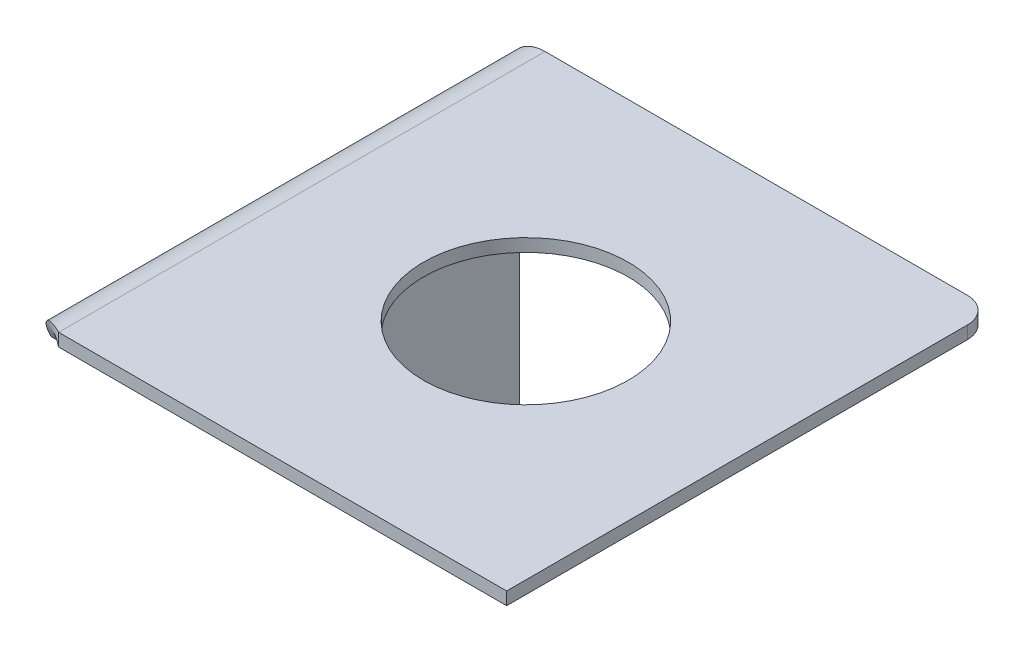
ISO-10303-21;
HEADER;
FILE_DESCRIPTION(('STEP AP214'),'2;1');
FILE_NAME('part.step','',(''),(''),'','','');
FILE_SCHEMA(('AUTOMOTIVE_DESIGN { 1 0 10303 214 1 1 1 1 }'));
ENDSEC;
DATA;
#1=APPLICATION_CONTEXT('core data for automotive mechanical design processes');
#2=APPLICATION_PROTOCOL_DEFINITION('international standard','automotive_design',2000,#1);
#3=PRODUCT_CONTEXT('',#1,'mechanical');
#4=PRODUCT('Part','Part','',(#3));
#5=PRODUCT_RELATED_PRODUCT_CATEGORY('part','',(#4));
#6=PRODUCT_DEFINITION_FORMATION('','',#4);
#7=PRODUCT_DEFINITION_CONTEXT('part definition',#1,'design');
#8=PRODUCT_DEFINITION('design','',#6,#7);
#9=PRODUCT_DEFINITION_SHAPE('','',#8);
#10=(LENGTH_UNIT() NAMED_UNIT(*) SI_UNIT(.MILLI.,.METRE.));
#11=(NAMED_UNIT(*) PLANE_ANGLE_UNIT() SI_UNIT($,.RADIAN.));
#12=(NAMED_UNIT(*) SI_UNIT($,.STERADIAN.) SOLID_ANGLE_UNIT());
#13=UNCERTAINTY_MEASURE_WITH_UNIT(LENGTH_MEASURE(1.E-05),#10,'distance_accuracy_value','');
#14=(GEOMETRIC_REPRESENTATION_CONTEXT(3) GLOBAL_UNCERTAINTY_ASSIGNED_CONTEXT((#13)) GLOBAL_UNIT_ASSIGNED_CONTEXT((#10,
#11,#12)) REPRESENTATION_CONTEXT('',''));
#15=CARTESIAN_POINT('',(0.,0.,0.));
#16=DIRECTION('',(0.,0.,1.));
#17=DIRECTION('',(1.,0.,0.));
#18=AXIS2_PLACEMENT_3D('',#15,#16,#17);
#19=CARTESIAN_POINT('',(-35.,2.,-38.));
#20=DIRECTION('',(0.,0.,-1.));
#21=DIRECTION('',(-1.,0.,0.));
#22=AXIS2_PLACEMENT_3D('',#19,#20,#21);
#23=PLANE('',#22);
#24=DIRECTION('',(0.,1.,0.));
#25=VECTOR('',#24,1.);
#26=CARTESIAN_POINT('',(31.,2.,-38.));
#27=LINE('',#26,#25);
#28=CARTESIAN_POINT('',(31.,0.,-38.));
#29=VERTEX_POINT('',#28);
#30=CARTESIAN_POINT('',(31.,2.,-38.));
#31=VERTEX_POINT('',#30);
#32=EDGE_CURVE('E13',#29,#31,#27,.T.);
#33=ORIENTED_EDGE('',*,*,#32,.F.);
#34=DIRECTION('',(1.,0.,0.));
#35=VECTOR('',#34,1.);
#36=CARTESIAN_POINT('',(31.,0.,-38.));
#37=LINE('',#36,#35);
#38=CARTESIAN_POINT('',(-35.,0.,-38.));
#39=VERTEX_POINT('',#38);
#40=EDGE_CURVE('E153',#29,#39,#37,.F.);
#41=ORIENTED_EDGE('',*,*,#40,.T.);
#42=DIRECTION('',(0.,1.,0.));
#43=VECTOR('',#42,1.);
#44=CARTESIAN_POINT('',(-35.,2.,-38.));
#45=LINE('',#44,#43);
#46=CARTESIAN_POINT('',(-35.,1.99999999999999,-38.));
#47=VERTEX_POINT('',#46);
#48=EDGE_CURVE('E64',#39,#47,#45,.T.);
#49=ORIENTED_EDGE('',*,*,#48,.T.);
#50=DIRECTION('',(-1.,0.,0.));
#51=VECTOR('',#50,1.);
#52=CARTESIAN_POINT('',(-35.,2.,-38.));
#53=LINE('',#52,#51);
#54=EDGE_CURVE('E130',#31,#47,#53,.T.);
#55=ORIENTED_EDGE('',*,*,#54,.F.);
#56=EDGE_LOOP('',(#33,#41,#49,#55));
#57=FACE_BOUND('',#56,.T.);
#58=ADVANCED_FACE('F54',(#57),#23,.T.);
#59=CARTESIAN_POINT('',(-35.,2.,38.));
#60=DIRECTION('',(0.,0.,1.));
#61=DIRECTION('',(1.,0.,0.));
#62=AXIS2_PLACEMENT_3D('',#59,#60,#61);
#63=PLANE('',#62);
#64=DIRECTION('',(0.,1.,0.));
#65=VECTOR('',#64,1.);
#66=CARTESIAN_POINT('',(-35.,2.,38.));
#67=LINE('',#66,#65);
#68=CARTESIAN_POINT('',(-35.,0.,38.));
#69=VERTEX_POINT('',#68);
#70=CARTESIAN_POINT('',(-35.,2.,38.));
#71=VERTEX_POINT('',#70);
#72=EDGE_CURVE('E159',#69,#71,#67,.T.);
#73=ORIENTED_EDGE('',*,*,#72,.F.);
#74=DIRECTION('',(1.,0.,0.));
#75=VECTOR('',#74,1.);
#76=CARTESIAN_POINT('',(31.,0.,38.));
#77=LINE('',#76,#75);
#78=CARTESIAN_POINT('',(35.,0.,38.));
#79=VERTEX_POINT('',#78);
#80=EDGE_CURVE('E148',#69,#79,#77,.T.);
#81=ORIENTED_EDGE('',*,*,#80,.T.);
#82=DIRECTION('',(0.,1.,0.));
#83=VECTOR('',#82,1.);
#84=CARTESIAN_POINT('',(35.,2.,38.));
#85=LINE('',#84,#83);
#86=CARTESIAN_POINT('',(35.,2.,38.));
#87=VERTEX_POINT('',#86);
#88=EDGE_CURVE('E72',#79,#87,#85,.T.);
#89=ORIENTED_EDGE('',*,*,#88,.T.);
#90=DIRECTION('',(1.,0.,0.));
#91=VECTOR('',#90,1.);
#92=CARTESIAN_POINT('',(-35.,2.,38.));
#93=LINE('',#92,#91);
#94=EDGE_CURVE('E136',#71,#87,#93,.T.);
#95=ORIENTED_EDGE('',*,*,#94,.F.);
#96=EDGE_LOOP('',(#73,#81,#89,#95));
#97=FACE_BOUND('',#96,.T.);
#98=ADVANCED_FACE('F171',(#97),#63,.T.);
#99=CARTESIAN_POINT('',(35.,2.,-34.));
#100=DIRECTION('',(1.,0.,0.));
#101=DIRECTION('',(0.,0.,-1.));
#102=AXIS2_PLACEMENT_3D('',#99,#100,#101);
#103=PLANE('',#102);
#104=ORIENTED_EDGE('',*,*,#88,.F.);
#105=DIRECTION('',(0.,0.,1.));
#106=VECTOR('',#105,1.);
#107=CARTESIAN_POINT('',(35.,0.,-34.));
#108=LINE('',#107,#106);
#109=CARTESIAN_POINT('',(35.,0.,-34.));
#110=VERTEX_POINT('',#109);
#111=EDGE_CURVE('E144',#79,#110,#108,.F.);
#112=ORIENTED_EDGE('',*,*,#111,.T.);
#113=DIRECTION('',(0.,1.,0.));
#114=VECTOR('',#113,1.);
#115=CARTESIAN_POINT('',(35.,2.,-34.));
#116=LINE('',#115,#114);
#117=CARTESIAN_POINT('',(35.,2.,-34.));
#118=VERTEX_POINT('',#117);
#119=EDGE_CURVE('E58',#110,#118,#116,.T.);
#120=ORIENTED_EDGE('',*,*,#119,.T.);
#121=DIRECTION('',(0.,0.,-1.));
#122=VECTOR('',#121,1.);
#123=CARTESIAN_POINT('',(35.,2.,-34.));
#124=LINE('',#123,#122);
#125=EDGE_CURVE('E132',#87,#118,#124,.T.);
#126=ORIENTED_EDGE('',*,*,#125,.F.);
#127=EDGE_LOOP('',(#104,#112,#120,#126));
#128=FACE_BOUND('',#127,.T.);
#129=ADVANCED_FACE('F173',(#128),#103,.T.);
#130=CARTESIAN_POINT('',(31.,2.,-34.));
#131=DIRECTION('',(0.,1.,0.));
#132=DIRECTION('',(0.,0.,1.));
#133=AXIS2_PLACEMENT_3D('',#130,#131,#132);
#134=CYLINDRICAL_SURFACE('',#133,4.);
#135=CARTESIAN_POINT('',(31.,0.,-34.));
#136=DIRECTION('',(0.,1.,0.));
#137=DIRECTION('',(0.,0.,1.));
#138=AXIS2_PLACEMENT_3D('',#135,#136,#137);
#139=CIRCLE('',#138,4.);
#140=EDGE_CURVE('E124',#110,#29,#139,.T.);
#141=ORIENTED_EDGE('',*,*,#140,.T.);
#142=ORIENTED_EDGE('',*,*,#32,.T.);
#143=CARTESIAN_POINT('',(31.,2.,-34.));
#144=DIRECTION('',(0.,1.,0.));
#145=DIRECTION('',(0.,0.,1.));
#146=AXIS2_PLACEMENT_3D('',#143,#144,#145);
#147=CIRCLE('',#146,4.);
#148=EDGE_CURVE('E123',#118,#31,#147,.T.);
#149=ORIENTED_EDGE('',*,*,#148,.F.);
#150=ORIENTED_EDGE('',*,*,#119,.F.);
#151=EDGE_LOOP('',(#141,#142,#149,#150));
#152=FACE_BOUND('',#151,.T.);
#153=ADVANCED_FACE('F122',(#152),#134,.T.);
#154=CARTESIAN_POINT('',(0.,2.,0.));
#155=DIRECTION('',(0.,1.,0.));
#156=DIRECTION('',(0.,0.,1.));
#157=AXIS2_PLACEMENT_3D('',#154,#155,#156);
#158=CYLINDRICAL_SURFACE('',#157,16.);
#159=CARTESIAN_POINT('',(0.,2.,0.));
#160=DIRECTION('',(0.,1.,0.));
#161=DIRECTION('',(0.,0.,1.));
#162=AXIS2_PLACEMENT_3D('',#159,#160,#161);
#163=CIRCLE('',#162,16.);
#164=CARTESIAN_POINT('',(0.,2.,16.));
#165=VERTEX_POINT('',#164);
#166=EDGE_CURVE('E141',#165,#165,#163,.T.);
#167=ORIENTED_EDGE('',*,*,#166,.T.);
#168=EDGE_LOOP('',(#167));
#169=FACE_BOUND('',#168,.T.);
#170=CARTESIAN_POINT('',(0.,0.,0.));
#171=DIRECTION('',(0.,1.,0.));
#172=DIRECTION('',(0.,0.,1.));
#173=AXIS2_PLACEMENT_3D('',#170,#171,#172);
#174=CIRCLE('',#173,16.);
#175=CARTESIAN_POINT('',(0.,0.,16.));
#176=VERTEX_POINT('',#175);
#177=EDGE_CURVE('E150',#176,#176,#174,.T.);
#178=ORIENTED_EDGE('',*,*,#177,.F.);
#179=EDGE_LOOP('',(#178));
#180=FACE_BOUND('',#179,.T.);
#181=ADVANCED_FACE('F56',(#169,#180),#158,.F.);
#182=CARTESIAN_POINT('',(31.,2.,-34.));
#183=DIRECTION('',(0.,1.,0.));
#184=DIRECTION('',(0.,0.,1.));
#185=AXIS2_PLACEMENT_3D('',#182,#183,#184);
#186=PLANE('',#185);
#187=ORIENTED_EDGE('',*,*,#125,.T.);
#188=ORIENTED_EDGE('',*,*,#148,.T.);
#189=ORIENTED_EDGE('',*,*,#54,.T.);
#190=DIRECTION('',(0.,0.,1.));
#191=VECTOR('',#190,1.);
#192=CARTESIAN_POINT('',(-35.,2.,-38.));
#193=LINE('',#192,#191);
#194=EDGE_CURVE('E100',#47,#71,#193,.T.);
#195=ORIENTED_EDGE('',*,*,#194,.T.);
#196=ORIENTED_EDGE('',*,*,#94,.T.);
#197=EDGE_LOOP('',(#187,#188,#189,#195,#196));
#198=FACE_BOUND('',#197,.T.);
#199=ORIENTED_EDGE('',*,*,#166,.F.);
#200=EDGE_LOOP('',(#199));
#201=FACE_BOUND('',#200,.T.);
#202=ADVANCED_FACE('F128',(#198,#201),#186,.T.);
#203=CARTESIAN_POINT('',(31.,0.,-34.));
#204=DIRECTION('',(0.,1.,0.));
#205=DIRECTION('',(0.,0.,1.));
#206=AXIS2_PLACEMENT_3D('',#203,#204,#205);
#207=PLANE('',#206);
#208=ORIENTED_EDGE('',*,*,#111,.F.);
#209=ORIENTED_EDGE('',*,*,#80,.F.);
#210=DIRECTION('',(0.,0.,1.));
#211=VECTOR('',#210,1.);
#212=CARTESIAN_POINT('',(-35.,0.,-34.));
#213=LINE('',#212,#211);
#214=EDGE_CURVE('E151',#39,#69,#213,.T.);
#215=ORIENTED_EDGE('',*,*,#214,.F.);
#216=ORIENTED_EDGE('',*,*,#40,.F.);
#217=ORIENTED_EDGE('',*,*,#140,.F.);
#218=EDGE_LOOP('',(#208,#209,#215,#216,#217));
#219=FACE_BOUND('',#218,.T.);
#220=ORIENTED_EDGE('',*,*,#177,.T.);
#221=EDGE_LOOP('',(#220));
#222=FACE_BOUND('',#221,.T.);
#223=ADVANCED_FACE('F191',(#219,#222),#207,.F.);
#224=CARTESIAN_POINT('',(-35.,2.01999999999999,38.));
#225=CARTESIAN_POINT('',(-35.7881288804153,2.01999999999999,37.5978260367179));
#226=CARTESIAN_POINT('',(-36.5757222638429,1.86331551354325,37.1957671957672));
#227=CARTESIAN_POINT('',(-38.0317862618328,1.26019405789263,36.3915343915344));
#228=CARTESIAN_POINT('',(-38.699571254249,0.813994391237041,35.989417989418));
#229=CARTESIAN_POINT('',(-39.813994391237,-0.300428745751012,35.1851851851852));
#230=CARTESIAN_POINT('',(-40.2601940578926,-0.968213738167183,34.7830687830688));
#231=CARTESIAN_POINT('',(-40.8633155135433,-2.42427773615713,33.978835978836));
#232=CARTESIAN_POINT('',(-41.02,-3.2118711195847,33.5767771378853));
#233=CARTESIAN_POINT('',(-41.02,-3.99999999999999,33.1746031746032));
#234=CARTESIAN_POINT('',(-35.,1.99999999999999,38.));
#235=CARTESIAN_POINT('',(-35.7855103583935,1.99999999999999,37.5978261551109));
#236=CARTESIAN_POINT('',(-36.5704873061557,1.84383606000989,37.1957671957672));
#237=CARTESIAN_POINT('',(-38.0217138822254,1.24271833012554,36.3915343915344));
#238=CARTESIAN_POINT('',(-38.6872803198495,0.798001054389077,35.989417989418));
#239=CARTESIAN_POINT('',(-39.7980010543891,-0.312719680150511,35.1851851851852));
#240=CARTESIAN_POINT('',(-40.2427183301255,-0.978286117774601,34.7830687830688));
#241=CARTESIAN_POINT('',(-40.8438360600099,-2.42951269384431,33.978835978836));
#242=CARTESIAN_POINT('',(-41.,-3.21448964160647,33.5767770194923));
#243=CARTESIAN_POINT('',(-41.,-3.99999999999999,33.1746031746032));
#244=CARTESIAN_POINT('',(-35.,0.,38.));
#245=CARTESIAN_POINT('',(-35.5236581562169,0.,37.5978379944143));
#246=CARTESIAN_POINT('',(-36.0469915374371,-0.104109293326747,37.1957671957672));
#247=CARTESIAN_POINT('',(-37.0144759214836,-0.504854446582975,36.3915343915344));
#248=CARTESIAN_POINT('',(-37.4581868798997,-0.801332630407285,35.989417989418));
#249=CARTESIAN_POINT('',(-38.1986673695927,-1.54181312010034,35.1851851851852));
#250=CARTESIAN_POINT('',(-38.495145553417,-1.9855240785164,34.7830687830688));
#251=CARTESIAN_POINT('',(-38.8958907066733,-2.95300846256288,33.978835978836));
#252=CARTESIAN_POINT('',(-39.,-3.47634184378311,33.5767651801889));
#253=CARTESIAN_POINT('',(-39.,-3.99999999999999,33.1746031746032));
#254=CARTESIAN_POINT('',(-35.,-0.0202000000000113,38.));
#255=CARTESIAN_POINT('',(-35.5210134489749,-0.0202000000000104,37.5978381139913));
#256=CARTESIAN_POINT('',(-36.0417042301731,-0.123783541395447,37.1957671957672));
#257=CARTESIAN_POINT('',(-37.0043028180801,-0.522504931627731,36.3915343915344));
#258=CARTESIAN_POINT('',(-37.4457730361562,-0.817485900623728,35.989417989418));
#259=CARTESIAN_POINT('',(-38.1825140993763,-1.55422696384384,35.1851851851852));
#260=CARTESIAN_POINT('',(-38.4774950683723,-1.9956971819199,34.7830687830688));
#261=CARTESIAN_POINT('',(-38.8762164586046,-2.95829576982693,33.978835978836));
#262=CARTESIAN_POINT('',(-38.9798,-3.4789865510251,33.5767650606119));
#263=CARTESIAN_POINT('',(-38.9798,-3.99999999999999,33.1746031746032));
#264=B_SPLINE_SURFACE_WITH_KNOTS('',1,3,((#224,#225,#226,#227,#228,#229,#230,#231,#232,#233),
(#234,#235,#236,#237,#238,#239,#240,#241,#242,#243),(#244,#245,#246,#247,#248,#249,#250,#251,
#252,#253),(#254,#255,#256,#257,#258,#259,#260,#261,#262,#263)),.UNSPECIFIED.,.F.,.F.,.F.,(2,1,
1,2),(4,2,2,2,4),(-0.01,0.,1.,1.0101),(0.,0.25,0.5,0.75,1.),.UNSPECIFIED.);
#265=DIRECTION('',(1.,0.,0.));
#266=VECTOR('',#265,1.);
#267=CARTESIAN_POINT('',(-41.,-3.99999999999998,33.1746031746032));
#268=LINE('',#267,#266);
#269=CARTESIAN_POINT('',(-39.,-3.99999999999999,33.1746031746032));
#270=VERTEX_POINT('',#269);
#271=CARTESIAN_POINT('',(-41.,-3.99999999999998,33.1746031746032));
#272=VERTEX_POINT('',#271);
#273=EDGE_CURVE('E244',#270,#272,#268,.F.);
#274=CARTESIAN_POINT('',(-35.,0.,38.));
#275=CARTESIAN_POINT('',(-35.1371000988277,2.68386396760108E-05,37.8947027146584));
#276=CARTESIAN_POINT('',(-35.2741986317457,-0.00704747959884162,37.789409791708));
#277=CARTESIAN_POINT('',(-35.5469400846744,-0.0352059034239967,37.578837613911));
#278=CARTESIAN_POINT('',(-35.6825831395901,-0.0562886989959288,37.473558358707));
#279=CARTESIAN_POINT('',(-35.9509108881448,-0.112255673205026,37.2630587398465));
#280=CARTESIAN_POINT('',(-36.0835972229131,-0.147131983461356,37.1578383768037));
#281=CARTESIAN_POINT('',(-36.3446903415254,-0.230308111603319,36.9473929033753));
#282=CARTESIAN_POINT('',(-36.4730970683597,-0.278608108229411,36.8421677929451));
#283=CARTESIAN_POINT('',(-36.728908937762,-0.39014486423582,36.6278372276383));
#284=CARTESIAN_POINT('',(-36.8561029448574,-0.453866304209749,36.5187316180512));
#285=CARTESIAN_POINT('',(-37.1030012069291,-0.594479625328623,36.3005256548683));
#286=CARTESIAN_POINT('',(-37.2227052038107,-0.671371959982233,36.1914253015829));
#287=CARTESIAN_POINT('',(-37.4532156924482,-0.837421389955762,35.9732545538899));
#288=CARTESIAN_POINT('',(-37.5640250979394,-0.926574442666144,35.8641841614321));
#289=CARTESIAN_POINT('',(-37.775534068466,-1.11615202756478,35.6460442594565));
#290=CARTESIAN_POINT('',(-37.8762338837627,-1.21657628060582,35.5369747499837));
#291=CARTESIAN_POINT('',(-38.0664196962945,-1.42759806601841,35.3188004594824));
#292=CARTESIAN_POINT('',(-38.1559019188649,-1.53819900120139,35.2096956789011));
#293=CARTESIAN_POINT('',(-38.322597999542,-1.76829071254195,34.9914947054686));
#294=CARTESIAN_POINT('',(-38.3998119890637,-1.88778139345404,34.8823985125381));
#295=CARTESIAN_POINT('',(-38.5410974286913,-2.13430753995689,34.6641847378143));
#296=CARTESIAN_POINT('',(-38.6051679033721,-2.26134356461184,34.5550671550346));
#297=CARTESIAN_POINT('',(-38.7194225809591,-2.52145668567284,34.3368737883238));
#298=CARTESIAN_POINT('',(-38.7696095245112,-2.65453258374565,34.2277980003937));
#299=CARTESIAN_POINT('',(-38.8745849892895,-2.98534003398537,33.9612571600308));
#300=CARTESIAN_POINT('',(-38.9215689104924,-3.18560609365389,33.8037543697095));
#301=CARTESIAN_POINT('',(-38.9685948617518,-3.48934027849037,33.5677162888728));
#302=CARTESIAN_POINT('',(-38.9803618276639,-3.59109304660447,33.4891092359093));
#303=CARTESIAN_POINT('',(-38.9960652260858,-3.79522018216465,33.3318777212117));
#304=CARTESIAN_POINT('',(-39.0000000978134,-3.89759466943078,33.2532532591299));
#305=CARTESIAN_POINT('',(-39.,-3.99999999999999,33.1746031746032));
#306=B_SPLINE_CURVE_WITH_KNOTS('',3,(#274,#275,#276,#277,#278,#279,#280,#281,#282,#283,#284,
#285,#286,#287,#288,#289,#290,#291,#292,#293,#294,#295,#296,#297,#298,#299,#300,#301,#302,#303,
#304,#305),.UNSPECIFIED.,.F.,.F.,(4,2,2,2,2,2,2,2,2,2,2,2,2,2,2,4),(0.,0.518459008242514,
1.03686953917114,1.55498477323025,2.07310690648151,2.61031494301825,3.14754148076526,
3.68459130673551,4.22162783484115,4.75884459077899,5.29605559175964,5.83330644659224,
6.37045117088813,7.1454696265827,7.53262106232836,7.91984964201423),.UNSPECIFIED.);
#307=EDGE_CURVE('E169',#69,#270,#306,.T.);
#308=CARTESIAN_POINT('',(-35.,1.99999999999999,38.));
#309=CARTESIAN_POINT('',(-35.1896944404609,2.00002898909438,37.9028733498143));
#310=CARTESIAN_POINT('',(-35.3793858058285,1.99100525133928,37.8057497708717));
#311=CARTESIAN_POINT('',(-35.7570564751078,1.95506100303011,37.6115125630341));
#312=CARTESIAN_POINT('',(-35.9450358823037,1.92814157948992,37.514398933893));
#313=CARTESIAN_POINT('',(-36.3174465321443,1.85664409137019,37.3202537343353));
#314=CARTESIAN_POINT('',(-36.5018805734431,1.8120806100032,37.2232221623028));
#315=CARTESIAN_POINT('',(-36.8656984356554,1.70570613996247,37.029152998189));
#316=CARTESIAN_POINT('',(-37.0450823327128,1.64389541148886,36.9321154062205));
#317=CARTESIAN_POINT('',(-37.3973607780907,1.5035123248757,36.7379508376156));
#318=CARTESIAN_POINT('',(-37.5702491468198,1.42492445787085,36.6408238616373));
#319=CARTESIAN_POINT('',(-37.9078112069347,1.25172552049908,36.4465716894544));
#320=CARTESIAN_POINT('',(-38.0724847252324,1.15711411269857,36.3494464933304));
#321=CARTESIAN_POINT('',(-38.3920725612051,0.952757256200236,36.1552362259676));
#322=CARTESIAN_POINT('',(-38.5469905033619,0.843017477040785,36.0581511532995));
#323=CARTESIAN_POINT('',(-38.8457365301487,0.609367777910968,35.8639735159151));
#324=CARTESIAN_POINT('',(-38.9895647063827,0.485457975009146,35.7668809512674));
#325=CARTESIAN_POINT('',(-39.26482290631,0.224598577072419,35.5727121000564));
#326=CARTESIAN_POINT('',(-39.3962548777608,0.0876510374135173,35.4756358133363));
#327=CARTESIAN_POINT('',(-39.6455662055498,-0.198071105794781,35.2814853260551));
#328=CARTESIAN_POINT('',(-39.7634455573519,-0.346845713302634,35.1844111254948));
#329=CARTESIAN_POINT('',(-39.9846727365595,-0.654998119155302,34.9901990102883));
#330=CARTESIAN_POINT('',(-40.0880101059324,-0.814383428187771,34.8930610997527));
#331=CARTESIAN_POINT('',(-40.2791163194523,-1.14221606546278,34.6987808890161));
#332=CARTESIAN_POINT('',(-40.3668857805029,-1.31066303427745,34.6016385891416));
#333=CARTESIAN_POINT('',(-40.5261404255902,-1.65525511313121,34.4072744315451));
#334=CARTESIAN_POINT('',(-40.5976120998903,-1.83140646647444,34.3100525743814));
#335=CARTESIAN_POINT('',(-40.7235324928528,-2.18968851952881,34.1156116563927));
#336=CARTESIAN_POINT('',(-40.7779817757305,-2.37181902083705,34.0183925955816));
#337=CARTESIAN_POINT('',(-40.8692814583398,-2.74005714784993,33.8241551389802));
#338=CARTESIAN_POINT('',(-40.9061658157674,-2.92615636686677,33.7271367200045));
#339=CARTESIAN_POINT('',(-40.9621432428735,-3.30092510066615,33.5331356766921));
#340=CARTESIAN_POINT('',(-40.9812474385319,-3.48959293302789,33.4361530679821));
#341=CARTESIAN_POINT('',(-40.9942609916483,-3.73220504237979,33.3117548032516));
#342=CARTESIAN_POINT('',(-40.9964140493268,-3.78576999394533,33.2843091761805));
#343=CARTESIAN_POINT('',(-40.9992826539336,-3.89288811514531,33.2294441605502));
#344=CARTESIAN_POINT('',(-40.9999995524467,-3.94644124838649,33.2020247716171));
#345=CARTESIAN_POINT('',(-41.,-3.99999999999999,33.1746031746032));
#346=B_SPLINE_CURVE_WITH_KNOTS('',3,(#308,#309,#310,#311,#312,#313,#314,#315,#316,#317,#318,
#319,#320,#321,#322,#323,#324,#325,#326,#327,#328,#329,#330,#331,#332,#333,#334,#335,#336,#337,
#338,#339,#340,#341,#342,#343,#344,#345),.UNSPECIFIED.,.F.,.F.,(4,2,2,2,2,2,2,2,2,2,2,2,2,2,2,2,
2,2,4),(0.,0.63914516267792,1.27825150615699,1.91683071283674,2.55540028612921,3.19456273214134,
3.83373863970423,4.47267565634744,5.11160739466335,5.7504385727991,6.38926996474919,
7.02855845705755,7.66782161085961,8.30761275870595,8.9473826981172,9.58591071894898,
10.2240389101252,10.4047041009966,10.5851991858897),.UNSPECIFIED.);
#347=EDGE_CURVE('E147',#71,#272,#346,.T.);
#348=ORIENTED_EDGE('',*,*,#273,.F.);
#349=ORIENTED_EDGE('',*,*,#307,.F.);
#350=ORIENTED_EDGE('',*,*,#72,.T.);
#351=ORIENTED_EDGE('',*,*,#347,.T.);
#352=EDGE_LOOP('',(#348,#349,#350,#351));
#353=FACE_BOUND('',#352,.T.);
#354=ADVANCED_FACE('F166',(#353),#264,.F.);
#355=CARTESIAN_POINT('',(-35.,-4.,-38.));
#356=DIRECTION('',(0.,0.,1.));
#357=DIRECTION('',(1.,0.,0.));
#358=AXIS2_PLACEMENT_3D('',#355,#356,#357);
#359=PLANE('',#358);
#360=CARTESIAN_POINT('',(-35.,-4.,-38.));
#361=DIRECTION('',(0.,0.,-1.));
#362=DIRECTION('',(-1.,0.,0.));
#363=AXIS2_PLACEMENT_3D('',#360,#361,#362);
#364=CIRCLE('',#363,3.99999999999999);
#365=CARTESIAN_POINT('',(-39.,-3.99999999999999,-38.));
#366=VERTEX_POINT('',#365);
#367=EDGE_CURVE('E232',#366,#39,#364,.T.);
#368=ORIENTED_EDGE('',*,*,#367,.F.);
#369=DIRECTION('',(1.,0.,0.));
#370=VECTOR('',#369,1.);
#371=CARTESIAN_POINT('',(-39.,-3.99999999999999,-38.));
#372=LINE('',#371,#370);
#373=CARTESIAN_POINT('',(-41.,-3.99999999999998,-38.));
#374=VERTEX_POINT('',#373);
#375=EDGE_CURVE('E248',#366,#374,#372,.F.);
#376=ORIENTED_EDGE('',*,*,#375,.T.);
#377=CARTESIAN_POINT('',(-35.,-4.,-38.));
#378=DIRECTION('',(0.,0.,-1.));
#379=DIRECTION('',(-1.,0.,0.));
#380=AXIS2_PLACEMENT_3D('',#377,#378,#379);
#381=CIRCLE('',#380,5.99999999999999);
#382=EDGE_CURVE('E231',#374,#47,#381,.T.);
#383=ORIENTED_EDGE('',*,*,#382,.T.);
#384=ORIENTED_EDGE('',*,*,#48,.F.);
#385=EDGE_LOOP('',(#368,#376,#383,#384));
#386=FACE_BOUND('',#385,.T.);
#387=ADVANCED_FACE('F202',(#386),#359,.F.);
#388=CARTESIAN_POINT('',(-35.,-4.,-38.));
#389=DIRECTION('',(0.,0.,-1.));
#390=DIRECTION('',(-1.,0.,0.));
#391=AXIS2_PLACEMENT_3D('',#388,#389,#390);
#392=CYLINDRICAL_SURFACE('',#391,5.99999999999999);
#393=ORIENTED_EDGE('',*,*,#194,.F.);
#394=ORIENTED_EDGE('',*,*,#382,.F.);
#395=DIRECTION('',(0.,0.,-1.));
#396=VECTOR('',#395,1.);
#397=CARTESIAN_POINT('',(-41.,-3.99999999999998,33.1746031746032));
#398=LINE('',#397,#396);
#399=EDGE_CURVE('E251',#374,#272,#398,.F.);
#400=ORIENTED_EDGE('',*,*,#399,.T.);
#401=ORIENTED_EDGE('',*,*,#347,.F.);
#402=EDGE_LOOP('',(#393,#394,#400,#401));
#403=FACE_BOUND('',#402,.T.);
#404=ADVANCED_FACE('F207',(#403),#392,.T.);
#405=CARTESIAN_POINT('',(-35.,-4.,-38.));
#406=DIRECTION('',(0.,0.,-1.));
#407=DIRECTION('',(-1.,0.,0.));
#408=AXIS2_PLACEMENT_3D('',#405,#406,#407);
#409=CYLINDRICAL_SURFACE('',#408,3.99999999999999);
#410=ORIENTED_EDGE('',*,*,#214,.T.);
#411=ORIENTED_EDGE('',*,*,#307,.T.);
#412=DIRECTION('',(0.,0.,-1.));
#413=VECTOR('',#412,1.);
#414=CARTESIAN_POINT('',(-39.,-3.99999999999999,33.1746031746032));
#415=LINE('',#414,#413);
#416=EDGE_CURVE('E246',#270,#366,#415,.T.);
#417=ORIENTED_EDGE('',*,*,#416,.T.);
#418=ORIENTED_EDGE('',*,*,#367,.T.);
#419=EDGE_LOOP('',(#410,#411,#417,#418));
#420=FACE_BOUND('',#419,.T.);
#421=ADVANCED_FACE('F213',(#420),#409,.F.);
#422=CARTESIAN_POINT('',(-41.0000000000002,-63.,-38.));
#423=DIRECTION('',(0.,0.,1.));
#424=DIRECTION('',(0.,-1.,0.));
#425=AXIS2_PLACEMENT_3D('',#422,#423,#424);
#426=PLANE('',#425);
#427=ORIENTED_EDGE('',*,*,#375,.F.);
#428=DIRECTION('',(0.,1.,0.));
#429=VECTOR('',#428,1.);
#430=CARTESIAN_POINT('',(-39.0000000000002,-63.,-38.));
#431=LINE('',#430,#429);
#432=CARTESIAN_POINT('',(-39.0000000000002,-63.,-38.));
#433=VERTEX_POINT('',#432);
#434=EDGE_CURVE('E253',#366,#433,#431,.F.);
#435=ORIENTED_EDGE('',*,*,#434,.T.);
#436=DIRECTION('',(1.,0.,0.));
#437=VECTOR('',#436,1.);
#438=CARTESIAN_POINT('',(-41.0000000000002,-63.,-38.));
#439=LINE('',#438,#437);
#440=CARTESIAN_POINT('',(-41.0000000000002,-63.,-38.));
#441=VERTEX_POINT('',#440);
#442=EDGE_CURVE('E237',#441,#433,#439,.T.);
#443=ORIENTED_EDGE('',*,*,#442,.F.);
#444=DIRECTION('',(0.,-1.,0.));
#445=VECTOR('',#444,1.);
#446=CARTESIAN_POINT('',(-41.,1.21970347371006E-13,-38.));
#447=LINE('',#446,#445);
#448=EDGE_CURVE('E259',#374,#441,#447,.T.);
#449=ORIENTED_EDGE('',*,*,#448,.F.);
#450=EDGE_LOOP('',(#427,#435,#443,#449));
#451=FACE_BOUND('',#450,.T.);
#452=ADVANCED_FACE('F275',(#451),#426,.F.);
#453=CARTESIAN_POINT('',(-41.0000000000002,-63.,-38.));
#454=DIRECTION('',(0.,0.769879349259755,-0.638189460570586));
#455=DIRECTION('',(0.,0.638189460570586,0.769879349259755));
#456=AXIS2_PLACEMENT_3D('',#453,#454,#455);
#457=PLANE('',#456);
#458=ORIENTED_EDGE('',*,*,#273,.T.);
#459=DIRECTION('',(0.,0.638189460570586,0.769879349259755));
#460=VECTOR('',#459,1.);
#461=CARTESIAN_POINT('',(-41.0000000000001,-18.6704976911236,15.4768599281684));
#462=LINE('',#461,#460);
#463=EDGE_CURVE('E241',#441,#272,#462,.T.);
#464=ORIENTED_EDGE('',*,*,#463,.F.);
#465=ORIENTED_EDGE('',*,*,#442,.T.);
#466=DIRECTION('',(0.,-0.638189460570586,-0.769879349259755));
#467=VECTOR('',#466,1.);
#468=CARTESIAN_POINT('',(-39.0000000000002,-63.,-38.));
#469=LINE('',#468,#467);
#470=EDGE_CURVE('E256',#433,#270,#469,.F.);
#471=ORIENTED_EDGE('',*,*,#470,.T.);
#472=EDGE_LOOP('',(#458,#464,#465,#471));
#473=FACE_BOUND('',#472,.T.);
#474=ADVANCED_FACE('F270',(#473),#457,.F.);
#475=CARTESIAN_POINT('',(-41.,1.30341076524926E-13,0.));
#476=DIRECTION('',(1.,0.,0.));
#477=DIRECTION('',(0.,1.,0.));
#478=AXIS2_PLACEMENT_3D('',#475,#476,#477);
#479=PLANE('',#478);
#480=ORIENTED_EDGE('',*,*,#399,.F.);
#481=ORIENTED_EDGE('',*,*,#448,.T.);
#482=ORIENTED_EDGE('',*,*,#463,.T.);
#483=EDGE_LOOP('',(#480,#481,#482));
#484=FACE_BOUND('',#483,.T.);
#485=ADVANCED_FACE('F266',(#484),#479,.F.);
#486=CARTESIAN_POINT('',(-39.,1.2335811384724E-13,0.));
#487=DIRECTION('',(1.,0.,0.));
#488=DIRECTION('',(0.,1.,0.));
#489=AXIS2_PLACEMENT_3D('',#486,#487,#488);
#490=PLANE('',#489);
#491=ORIENTED_EDGE('',*,*,#434,.F.);
#492=ORIENTED_EDGE('',*,*,#416,.F.);
#493=ORIENTED_EDGE('',*,*,#470,.F.);
#494=EDGE_LOOP('',(#491,#492,#493));
#495=FACE_BOUND('',#494,.T.);
#496=ADVANCED_FACE('F279',(#495),#490,.T.);
#497=CLOSED_SHELL('',(#58,#98,#129,#153,#181,#202,#223,#354,#387,#404,#421,#452,#474,#485,#496));
#498=MANIFOLD_SOLID_BREP('B2',#497);
#499=ADVANCED_BREP_SHAPE_REPRESENTATION('',(#18,#498),#14);
#500=SHAPE_DEFINITION_REPRESENTATION(#9,#499);
ENDSEC;
END-ISO-10303-21;
